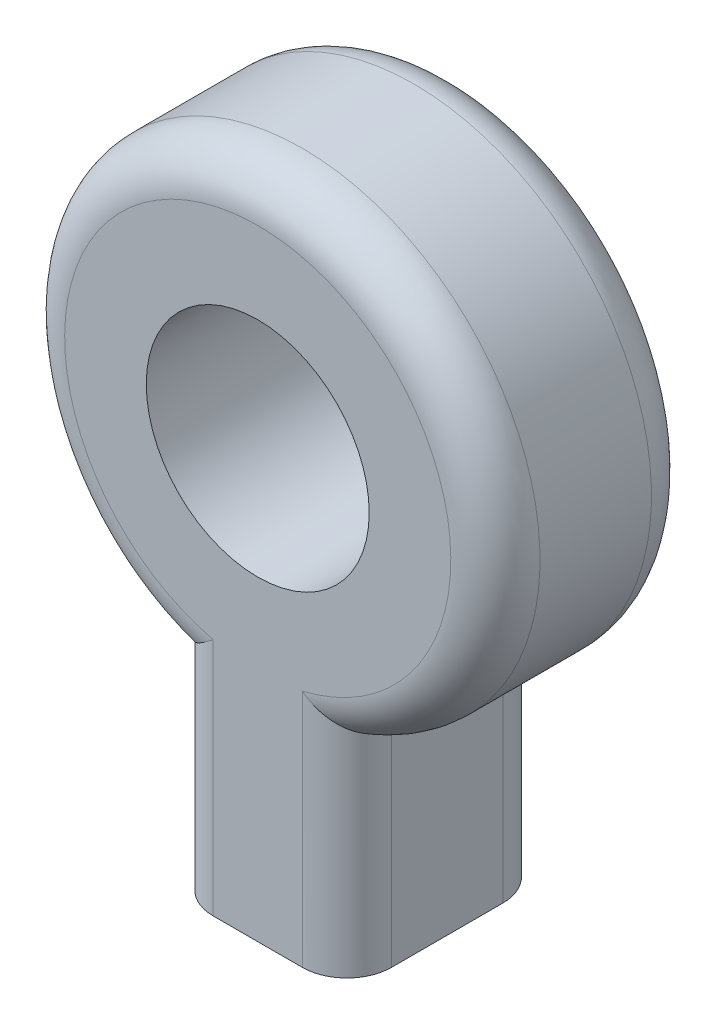
ISO-10303-21;
HEADER;
FILE_DESCRIPTION(('STEP AP214'),'2;1');
FILE_NAME('part.step','',(''),(''),'','','');
FILE_SCHEMA(('AUTOMOTIVE_DESIGN { 1 0 10303 214 1 1 1 1 }'));
ENDSEC;
DATA;
#1=APPLICATION_CONTEXT('core data for automotive mechanical design processes');
#2=APPLICATION_PROTOCOL_DEFINITION('international standard','automotive_design',2000,#1);
#3=PRODUCT_CONTEXT('',#1,'mechanical');
#4=PRODUCT('Part','Part','',(#3));
#5=PRODUCT_RELATED_PRODUCT_CATEGORY('part','',(#4));
#6=PRODUCT_DEFINITION_FORMATION('','',#4);
#7=PRODUCT_DEFINITION_CONTEXT('part definition',#1,'design');
#8=PRODUCT_DEFINITION('design','',#6,#7);
#9=PRODUCT_DEFINITION_SHAPE('','',#8);
#10=(LENGTH_UNIT() NAMED_UNIT(*) SI_UNIT(.MILLI.,.METRE.));
#11=(NAMED_UNIT(*) PLANE_ANGLE_UNIT() SI_UNIT($,.RADIAN.));
#12=(NAMED_UNIT(*) SI_UNIT($,.STERADIAN.) SOLID_ANGLE_UNIT());
#13=UNCERTAINTY_MEASURE_WITH_UNIT(LENGTH_MEASURE(1.E-05),#10,'distance_accuracy_value','');
#14=(GEOMETRIC_REPRESENTATION_CONTEXT(3) GLOBAL_UNCERTAINTY_ASSIGNED_CONTEXT((#13)) GLOBAL_UNIT_ASSIGNED_CONTEXT((#10,
#11,#12)) REPRESENTATION_CONTEXT('',''));
#15=CARTESIAN_POINT('',(0.,0.,0.));
#16=DIRECTION('',(0.,0.,1.));
#17=DIRECTION('',(1.,0.,0.));
#18=AXIS2_PLACEMENT_3D('',#15,#16,#17);
#19=CARTESIAN_POINT('',(0.,28.7650596911522,9.));
#20=DIRECTION('',(0.,0.,1.));
#21=DIRECTION('',(1.,0.,0.));
#22=AXIS2_PLACEMENT_3D('',#19,#20,#21);
#23=PLANE('',#22);
#24=CARTESIAN_POINT('',(0.,28.7650596911522,9.));
#25=DIRECTION('',(0.,0.,1.));
#26=DIRECTION('',(1.,0.,0.));
#27=AXIS2_PLACEMENT_3D('',#24,#25,#26);
#28=CIRCLE('',#27,8.66021948891792);
#29=CARTESIAN_POINT('',(2.00000000000001,20.3389454267813,9.));
#30=VERTEX_POINT('',#29);
#31=CARTESIAN_POINT('',(-1.9962519981702,20.3380566915066,9.));
#32=VERTEX_POINT('',#31);
#33=EDGE_CURVE('E54',#30,#32,#28,.T.);
#34=ORIENTED_EDGE('',*,*,#33,.T.);
#35=DIRECTION('',(0.,-1.,0.));
#36=VECTOR('',#35,1.);
#37=CARTESIAN_POINT('',(-1.9962519981702,9.60335118495618,9.));
#38=LINE('',#37,#36);
#39=CARTESIAN_POINT('',(-1.9962519981702,9.60335118495618,9.));
#40=VERTEX_POINT('',#39);
#41=EDGE_CURVE('E11',#32,#40,#38,.T.);
#42=ORIENTED_EDGE('',*,*,#41,.T.);
#43=DIRECTION('',(1.,0.,0.));
#44=VECTOR('',#43,1.);
#45=CARTESIAN_POINT('',(0.,9.60335118495618,9.));
#46=LINE('',#45,#44);
#47=CARTESIAN_POINT('',(2.00000000000001,9.60335118495618,9.));
#48=VERTEX_POINT('',#47);
#49=EDGE_CURVE('E227',#40,#48,#46,.T.);
#50=ORIENTED_EDGE('',*,*,#49,.T.);
#51=DIRECTION('',(0.,1.,0.));
#52=VECTOR('',#51,1.);
#53=CARTESIAN_POINT('',(2.00000000000001,18.8837500840249,9.));
#54=LINE('',#53,#52);
#55=EDGE_CURVE('E47',#48,#30,#54,.T.);
#56=ORIENTED_EDGE('',*,*,#55,.T.);
#57=EDGE_LOOP('',(#34,#42,#50,#56));
#58=FACE_BOUND('',#57,.T.);
#59=CARTESIAN_POINT('',(0.,28.7650596911522,9.));
#60=DIRECTION('',(0.,0.,1.));
#61=DIRECTION('',(1.,0.,0.));
#62=AXIS2_PLACEMENT_3D('',#59,#60,#61);
#63=CIRCLE('',#62,5.);
#64=CARTESIAN_POINT('',(5.,28.7650596911522,9.));
#65=VERTEX_POINT('',#64);
#66=EDGE_CURVE('E231',#65,#65,#63,.T.);
#67=ORIENTED_EDGE('',*,*,#66,.F.);
#68=EDGE_LOOP('',(#67));
#69=FACE_BOUND('',#68,.T.);
#70=ADVANCED_FACE('F33',(#58,#69),#23,.T.);
#71=CARTESIAN_POINT('',(0.,28.7650596911522,0.));
#72=DIRECTION('',(0.,0.,1.));
#73=DIRECTION('',(1.,0.,0.));
#74=AXIS2_PLACEMENT_3D('',#71,#72,#73);
#75=PLANE('',#74);
#76=CARTESIAN_POINT('',(0.,28.7650596911522,0.));
#77=DIRECTION('',(0.,0.,1.));
#78=DIRECTION('',(1.,0.,0.));
#79=AXIS2_PLACEMENT_3D('',#76,#77,#78);
#80=CIRCLE('',#79,8.66021948891792);
#81=CARTESIAN_POINT('',(-1.9962519981702,20.3380566915066,0.));
#82=VERTEX_POINT('',#81);
#83=CARTESIAN_POINT('',(2.00000000000001,20.3389454267813,0.));
#84=VERTEX_POINT('',#83);
#85=EDGE_CURVE('E217',#82,#84,#80,.F.);
#86=ORIENTED_EDGE('',*,*,#85,.T.);
#87=DIRECTION('',(0.,1.,0.));
#88=VECTOR('',#87,1.);
#89=CARTESIAN_POINT('',(2.00000000000001,28.7650596911522,0.));
#90=LINE('',#89,#88);
#91=CARTESIAN_POINT('',(2.00000000000001,9.60335118495618,0.));
#92=VERTEX_POINT('',#91);
#93=EDGE_CURVE('E215',#84,#92,#90,.F.);
#94=ORIENTED_EDGE('',*,*,#93,.T.);
#95=DIRECTION('',(1.,0.,0.));
#96=VECTOR('',#95,1.);
#97=CARTESIAN_POINT('',(-3.9962519981702,9.60335118495618,0.));
#98=LINE('',#97,#96);
#99=CARTESIAN_POINT('',(-1.9962519981702,9.60335118495618,0.));
#100=VERTEX_POINT('',#99);
#101=EDGE_CURVE('E228',#100,#92,#98,.T.);
#102=ORIENTED_EDGE('',*,*,#101,.F.);
#103=DIRECTION('',(0.,-1.,0.));
#104=VECTOR('',#103,1.);
#105=CARTESIAN_POINT('',(-1.9962519981702,28.7650596911522,0.));
#106=LINE('',#105,#104);
#107=EDGE_CURVE('E219',#100,#82,#106,.F.);
#108=ORIENTED_EDGE('',*,*,#107,.T.);
#109=EDGE_LOOP('',(#86,#94,#102,#108));
#110=FACE_BOUND('',#109,.T.);
#111=CARTESIAN_POINT('',(0.,28.7650596911522,0.));
#112=DIRECTION('',(0.,0.,1.));
#113=DIRECTION('',(1.,0.,0.));
#114=AXIS2_PLACEMENT_3D('',#111,#112,#113);
#115=CIRCLE('',#114,5.);
#116=CARTESIAN_POINT('',(5.,28.7650596911522,0.));
#117=VERTEX_POINT('',#116);
#118=EDGE_CURVE('E233',#117,#117,#115,.T.);
#119=ORIENTED_EDGE('',*,*,#118,.T.);
#120=EDGE_LOOP('',(#119));
#121=FACE_BOUND('',#120,.T.);
#122=ADVANCED_FACE('F168',(#110,#121),#75,.F.);
#123=CARTESIAN_POINT('',(4.00000000000001,9.60335118495618,9.));
#124=DIRECTION('',(-1.,0.,0.));
#125=DIRECTION('',(0.,0.,1.));
#126=AXIS2_PLACEMENT_3D('',#123,#124,#125);
#127=PLANE('',#126);
#128=DIRECTION('',(0.,0.,-1.));
#129=VECTOR('',#128,1.);
#130=CARTESIAN_POINT('',(4.00000000000001,9.60335118495618,9.));
#131=LINE('',#130,#129);
#132=CARTESIAN_POINT('',(4.00000000000001,9.60335118495618,7.));
#133=VERTEX_POINT('',#132);
#134=CARTESIAN_POINT('',(4.00000000000001,9.60335118495618,2.));
#135=VERTEX_POINT('',#134);
#136=EDGE_CURVE('E126',#133,#135,#131,.T.);
#137=ORIENTED_EDGE('',*,*,#136,.T.);
#138=DIRECTION('',(0.,1.,0.));
#139=VECTOR('',#138,1.);
#140=CARTESIAN_POINT('',(4.00000000000001,9.60335118495618,2.));
#141=LINE('',#140,#139);
#142=CARTESIAN_POINT('',(4.,18.8837500840249,2.));
#143=VERTEX_POINT('',#142);
#144=EDGE_CURVE('E125',#135,#143,#141,.T.);
#145=ORIENTED_EDGE('',*,*,#144,.T.);
#146=DIRECTION('',(0.,0.,-1.));
#147=VECTOR('',#146,1.);
#148=CARTESIAN_POINT('',(4.,18.8837500840249,9.));
#149=LINE('',#148,#147);
#150=CARTESIAN_POINT('',(4.,18.8837500840249,7.));
#151=VERTEX_POINT('',#150);
#152=EDGE_CURVE('E108',#151,#143,#149,.T.);
#153=ORIENTED_EDGE('',*,*,#152,.F.);
#154=DIRECTION('',(0.,1.,0.));
#155=VECTOR('',#154,1.);
#156=CARTESIAN_POINT('',(4.00000000000001,9.60335118495618,7.));
#157=LINE('',#156,#155);
#158=EDGE_CURVE('E122',#151,#133,#157,.F.);
#159=ORIENTED_EDGE('',*,*,#158,.T.);
#160=EDGE_LOOP('',(#137,#145,#153,#159));
#161=FACE_BOUND('',#160,.T.);
#162=ADVANCED_FACE('F121',(#161),#127,.F.);
#163=CARTESIAN_POINT('',(0.,28.7650596911522,9.));
#164=DIRECTION('',(0.,0.,-1.));
#165=DIRECTION('',(-1.,0.,0.));
#166=AXIS2_PLACEMENT_3D('',#163,#164,#165);
#167=CYLINDRICAL_SURFACE('',#166,10.6602194889179);
#168=ORIENTED_EDGE('',*,*,#152,.T.);
#169=CARTESIAN_POINT('',(0.,28.7650596911522,2.));
#170=DIRECTION('',(0.,0.,1.));
#171=DIRECTION('',(1.,0.,0.));
#172=AXIS2_PLACEMENT_3D('',#169,#170,#171);
#173=CIRCLE('',#172,10.6602194889179);
#174=CARTESIAN_POINT('',(-3.9962519981702,18.8822337026494,2.));
#175=VERTEX_POINT('',#174);
#176=EDGE_CURVE('E114',#143,#175,#173,.T.);
#177=ORIENTED_EDGE('',*,*,#176,.T.);
#178=DIRECTION('',(0.,0.,-1.));
#179=VECTOR('',#178,1.);
#180=CARTESIAN_POINT('',(-3.9962519981702,18.8822337026494,9.));
#181=LINE('',#180,#179);
#182=CARTESIAN_POINT('',(-3.9962519981702,18.8822337026494,7.));
#183=VERTEX_POINT('',#182);
#184=EDGE_CURVE('E110',#183,#175,#181,.T.);
#185=ORIENTED_EDGE('',*,*,#184,.F.);
#186=CARTESIAN_POINT('',(0.,28.7650596911522,7.));
#187=DIRECTION('',(0.,0.,1.));
#188=DIRECTION('',(1.,0.,0.));
#189=AXIS2_PLACEMENT_3D('',#186,#187,#188);
#190=CIRCLE('',#189,10.6602194889179);
#191=EDGE_CURVE('E105',#183,#151,#190,.F.);
#192=ORIENTED_EDGE('',*,*,#191,.T.);
#193=EDGE_LOOP('',(#168,#177,#185,#192));
#194=FACE_BOUND('',#193,.T.);
#195=ADVANCED_FACE('F107',(#194),#167,.T.);
#196=CARTESIAN_POINT('',(-3.9962519981702,18.8822337026494,9.));
#197=DIRECTION('',(1.,0.,0.));
#198=DIRECTION('',(0.,1.,0.));
#199=AXIS2_PLACEMENT_3D('',#196,#197,#198);
#200=PLANE('',#199);
#201=ORIENTED_EDGE('',*,*,#184,.T.);
#202=DIRECTION('',(0.,-1.,0.));
#203=VECTOR('',#202,1.);
#204=CARTESIAN_POINT('',(-3.9962519981702,18.8822337026494,2.));
#205=LINE('',#204,#203);
#206=CARTESIAN_POINT('',(-3.9962519981702,9.60335118495618,2.));
#207=VERTEX_POINT('',#206);
#208=EDGE_CURVE('E204',#175,#207,#205,.T.);
#209=ORIENTED_EDGE('',*,*,#208,.T.);
#210=DIRECTION('',(0.,0.,-1.));
#211=VECTOR('',#210,1.);
#212=CARTESIAN_POINT('',(-3.9962519981702,9.60335118495618,9.));
#213=LINE('',#212,#211);
#214=CARTESIAN_POINT('',(-3.9962519981702,9.60335118495618,7.));
#215=VERTEX_POINT('',#214);
#216=EDGE_CURVE('E224',#215,#207,#213,.T.);
#217=ORIENTED_EDGE('',*,*,#216,.F.);
#218=DIRECTION('',(0.,-1.,0.));
#219=VECTOR('',#218,1.);
#220=CARTESIAN_POINT('',(-3.9962519981702,18.8822337026494,7.));
#221=LINE('',#220,#219);
#222=EDGE_CURVE('E206',#215,#183,#221,.F.);
#223=ORIENTED_EDGE('',*,*,#222,.T.);
#224=EDGE_LOOP('',(#201,#209,#217,#223));
#225=FACE_BOUND('',#224,.T.);
#226=ADVANCED_FACE('F183',(#225),#200,.F.);
#227=CARTESIAN_POINT('',(-3.9962519981702,9.60335118495618,9.));
#228=DIRECTION('',(0.,1.,0.));
#229=DIRECTION('',(0.,0.,1.));
#230=AXIS2_PLACEMENT_3D('',#227,#228,#229);
#231=PLANE('',#230);
#232=CARTESIAN_POINT('',(0.,9.60335118495618,4.56914072073836));
#233=DIRECTION('',(0.,-1.,0.));
#234=DIRECTION('',(0.,0.,-1.));
#235=AXIS2_PLACEMENT_3D('',#232,#233,#234);
#236=CIRCLE('',#235,3.);
#237=CARTESIAN_POINT('',(0.,9.60335118495618,1.56914072073836));
#238=VERTEX_POINT('',#237);
#239=EDGE_CURVE('E142',#238,#238,#236,.T.);
#240=ORIENTED_EDGE('',*,*,#239,.F.);
#241=EDGE_LOOP('',(#240));
#242=FACE_BOUND('',#241,.T.);
#243=ORIENTED_EDGE('',*,*,#101,.T.);
#244=CARTESIAN_POINT('',(2.00000000000001,9.60335118495618,2.));
#245=DIRECTION('',(0.,1.,0.));
#246=DIRECTION('',(0.,0.,1.));
#247=AXIS2_PLACEMENT_3D('',#244,#245,#246);
#248=CIRCLE('',#247,2.);
#249=EDGE_CURVE('E115',#92,#135,#248,.F.);
#250=ORIENTED_EDGE('',*,*,#249,.T.);
#251=ORIENTED_EDGE('',*,*,#136,.F.);
#252=CARTESIAN_POINT('',(2.00000000000001,9.60335118495618,7.));
#253=DIRECTION('',(0.,1.,0.));
#254=DIRECTION('',(0.,0.,1.));
#255=AXIS2_PLACEMENT_3D('',#252,#253,#254);
#256=CIRCLE('',#255,2.);
#257=EDGE_CURVE('E130',#133,#48,#256,.F.);
#258=ORIENTED_EDGE('',*,*,#257,.T.);
#259=ORIENTED_EDGE('',*,*,#49,.F.);
#260=CARTESIAN_POINT('',(-1.9962519981702,9.60335118495618,7.));
#261=DIRECTION('',(0.,1.,0.));
#262=DIRECTION('',(0.,0.,1.));
#263=AXIS2_PLACEMENT_3D('',#260,#261,#262);
#264=CIRCLE('',#263,2.);
#265=EDGE_CURVE('E212',#40,#215,#264,.F.);
#266=ORIENTED_EDGE('',*,*,#265,.T.);
#267=ORIENTED_EDGE('',*,*,#216,.T.);
#268=CARTESIAN_POINT('',(-1.9962519981702,9.60335118495618,2.));
#269=DIRECTION('',(0.,1.,0.));
#270=DIRECTION('',(0.,0.,1.));
#271=AXIS2_PLACEMENT_3D('',#268,#269,#270);
#272=CIRCLE('',#271,2.);
#273=EDGE_CURVE('E210',#207,#100,#272,.F.);
#274=ORIENTED_EDGE('',*,*,#273,.T.);
#275=EDGE_LOOP('',(#243,#250,#251,#258,#259,#266,#267,#274));
#276=FACE_BOUND('',#275,.T.);
#277=ADVANCED_FACE('F180',(#242,#276),#231,.F.);
#278=CARTESIAN_POINT('',(0.,28.7650596911522,9.));
#279=DIRECTION('',(0.,0.,-1.));
#280=DIRECTION('',(-1.,0.,0.));
#281=AXIS2_PLACEMENT_3D('',#278,#279,#280);
#282=CYLINDRICAL_SURFACE('',#281,5.);
#283=ORIENTED_EDGE('',*,*,#66,.T.);
#284=EDGE_LOOP('',(#283));
#285=FACE_BOUND('',#284,.T.);
#286=ORIENTED_EDGE('',*,*,#118,.F.);
#287=EDGE_LOOP('',(#286));
#288=FACE_BOUND('',#287,.T.);
#289=ADVANCED_FACE('F177',(#285,#288),#282,.F.);
#290=CARTESIAN_POINT('',(-1.9962519981702,18.8822337026494,2.));
#291=DIRECTION('',(0.,-1.,0.));
#292=DIRECTION('',(1.,0.,0.));
#293=AXIS2_PLACEMENT_3D('',#290,#291,#292);
#294=CYLINDRICAL_SURFACE('',#293,2.);
#295=ORIENTED_EDGE('',*,*,#273,.F.);
#296=ORIENTED_EDGE('',*,*,#208,.F.);
#297=CARTESIAN_POINT('',(-3.9962519981702,18.8822337026494,2.));
#298=CARTESIAN_POINT('',(-3.99626122357544,18.8822284248516,1.95078015179967));
#299=CARTESIAN_POINT('',(-3.99443530883954,18.8834587149459,1.90156561154152));
#300=CARTESIAN_POINT('',(-3.98718371502805,18.8883497661438,1.80354236597555));
#301=CARTESIAN_POINT('',(-3.98175941496516,18.8920095961727,1.75473351244857));
#302=CARTESIAN_POINT('',(-3.96741628824523,18.9016956046794,1.65811314703024));
#303=CARTESIAN_POINT('',(-3.95851451524217,18.9077102354417,1.61029794944754));
#304=CARTESIAN_POINT('',(-3.93735404063978,18.9220259946845,1.51577693035738));
#305=CARTESIAN_POINT('',(-3.9250951619568,18.9303272437817,1.46907116751267));
#306=CARTESIAN_POINT('',(-3.88354985592826,18.9585047891648,1.33120550815071));
#307=CARTESIAN_POINT('',(-3.84946457408325,18.9816751422819,1.24209939916828));
#308=CARTESIAN_POINT('',(-3.77018894432698,19.0358241132337,1.07154761268315));
#309=CARTESIAN_POINT('',(-3.72498775252442,19.0668103564578,0.990109523482096));
#310=CARTESIAN_POINT('',(-3.62250112656296,19.1374827165494,0.831794124688671));
#311=CARTESIAN_POINT('',(-3.56466938079167,19.1775673097876,0.755450166328622));
#312=CARTESIAN_POINT('',(-3.4409144528931,19.2639747927498,0.613703980858329));
#313=CARTESIAN_POINT('',(-3.37498905632077,19.3102993900945,0.548304759876112));
#314=CARTESIAN_POINT('',(-3.22602392643064,19.41584027258,0.419222374366774));
#315=CARTESIAN_POINT('',(-3.14193141836919,19.4759343672328,0.357475558992229));
#316=CARTESIAN_POINT('',(-2.96816364350988,19.6014413080748,0.249029471080511));
#317=CARTESIAN_POINT('',(-2.87848285549452,19.6668594345734,0.202345371024312));
#318=CARTESIAN_POINT('',(-2.67860165027871,19.8143560961146,0.116291154826333));
#319=CARTESIAN_POINT('',(-2.56771076695944,19.8972561245496,0.0799414440868841));
#320=CARTESIAN_POINT('',(-2.34429800812875,20.066767560369,0.0271790327390546));
#321=CARTESIAN_POINT('',(-2.2317782638339,20.1533743651672,0.0107423100582177));
#322=CARTESIAN_POINT('',(-2.08083409041852,20.2713790188956,0.00141074699120206));
#323=CARTESIAN_POINT('',(-2.04206071939154,20.301853997934,0.000150243912356059));
#324=CARTESIAN_POINT('',(-2.00099373746383,20.3343076105949,4.21694619416417E-06));
#325=CARTESIAN_POINT('',(-1.99862271844948,20.3361819569129,1.91203697017922E-09));
#326=CARTESIAN_POINT('',(-1.9962519981702,20.3380566915066,0.));
#327=B_SPLINE_CURVE_WITH_KNOTS('',3,(#297,#298,#299,#300,#301,#302,#303,#304,#305,#306,#307,
#308,#309,#310,#311,#312,#313,#314,#315,#316,#317,#318,#319,#320,#321,#322,#323,#324,#325,#326),
.UNSPECIFIED.,.F.,.F.,(4,2,2,2,2,2,2,2,2,2,2,2,2,2,4),(0.,0.147601487794811,0.2951464427801,
0.441976736193232,0.588814776235774,0.881895163894845,1.17526260205321,1.48553764586616,
1.79589777176707,2.15574474237638,2.51595305878731,2.94381350049727,3.37115727630907,
3.51911825661596,3.52818545874163),.UNSPECIFIED.);
#328=EDGE_CURVE('E135',#82,#175,#327,.F.);
#329=ORIENTED_EDGE('',*,*,#328,.F.);
#330=ORIENTED_EDGE('',*,*,#107,.F.);
#331=EDGE_LOOP('',(#295,#296,#329,#330));
#332=FACE_BOUND('',#331,.T.);
#333=ADVANCED_FACE('F256',(#332),#294,.T.);
#334=CARTESIAN_POINT('',(0.,28.7650596911522,2.));
#335=DIRECTION('',(0.,0.,1.));
#336=DIRECTION('',(1.,0.,0.));
#337=AXIS2_PLACEMENT_3D('',#334,#335,#336);
#338=TOROIDAL_SURFACE('',#337,8.66021948891792,2.);
#339=ORIENTED_EDGE('',*,*,#328,.T.);
#340=ORIENTED_EDGE('',*,*,#176,.F.);
#341=CARTESIAN_POINT('',(4.,18.8837500840249,2.));
#342=CARTESIAN_POINT('',(4.00000922368036,18.8837448096422,1.95077590802549));
#343=CARTESIAN_POINT('',(3.99818299722824,18.8849748064946,1.90155712215185));
#344=CARTESIAN_POINT('',(3.99093014684629,18.8898647040558,1.80352537831182));
#345=CARTESIAN_POINT('',(3.98550490133219,18.8935236744739,1.75471227221542));
#346=CARTESIAN_POINT('',(3.97115922615978,18.9032074399699,1.65808331412721));
#347=CARTESIAN_POINT('',(3.96225584473796,18.9092206957271,1.61026377824288));
#348=CARTESIAN_POINT('',(3.94109147937062,18.923533226539,1.51573412349467));
#349=CARTESIAN_POINT('',(3.9288303184619,18.9318326220789,1.46902406324392));
#350=CARTESIAN_POINT('',(3.88727709837328,18.9600039944267,1.33114553105213));
#351=CARTESIAN_POINT('',(3.85318512834112,18.9831694000172,1.24203095323037));
#352=CARTESIAN_POINT('',(3.77389325266284,19.0373072674519,1.07146305090219));
#353=CARTESIAN_POINT('',(3.72868250803365,19.068287348085,0.99001731003716));
#354=CARTESIAN_POINT('',(3.62617467399787,19.1389453276208,0.831689653948475));
#355=CARTESIAN_POINT('',(3.56833136769175,19.1790214675837,0.755340917347559));
#356=CARTESIAN_POINT('',(3.44455085446957,19.2654112891507,0.613586920423197));
#357=CARTESIAN_POINT('',(3.37861143264503,19.3117266780063,0.548184666418519));
#358=CARTESIAN_POINT('',(3.22962046313914,19.4172424033488,0.419104171694145));
#359=CARTESIAN_POINT('',(3.14551646917437,19.4773198918424,0.357361428010906));
#360=CARTESIAN_POINT('',(2.97172435857855,19.6027924201645,0.248925073611785));
#361=CARTESIAN_POINT('',(2.88203071891181,19.6681927395556,0.202246638258926));
#362=CARTESIAN_POINT('',(2.68213125540909,19.815641380215,0.11621208881559));
#363=CARTESIAN_POINT('',(2.57123525140741,19.8985104333531,0.0798747916256295));
#364=CARTESIAN_POINT('',(2.34781202194297,20.0679580573316,0.0271376500155976));
#365=CARTESIAN_POINT('',(2.23528693103274,20.1545320215962,0.0107137510764177));
#366=CARTESIAN_POINT('',(2.08441994091223,20.2724255451675,0.00140549836428077));
#367=CARTESIAN_POINT('',(2.04572866850118,20.3028225086915,0.000149990594465479));
#368=CARTESIAN_POINT('',(2.00474282305427,20.3351972026871,4.21887703164546E-06));
#369=CARTESIAN_POINT('',(2.00237126227224,20.3370711205654,1.91588530590229E-09));
#370=CARTESIAN_POINT('',(2.00000000000001,20.3389454267813,0.));
#371=B_SPLINE_CURVE_WITH_KNOTS('',3,(#341,#342,#343,#344,#345,#346,#347,#348,#349,#350,#351,
#352,#353,#354,#355,#356,#357,#358,#359,#360,#361,#362,#363,#364,#365,#366,#367,#368,#369,#370),
.UNSPECIFIED.,.F.,.F.,(4,2,2,2,2,2,2,2,2,2,2,2,2,2,4),(0.,0.147614221976313,0.295171940672569,
0.442015294691447,0.58886638920506,0.881973149135116,1.17536678065796,1.4856616701914,
1.79604163911619,2.15588139674413,2.51608252350959,2.94389159978855,3.3711833848001,
3.5188061250612,3.527873805358),.UNSPECIFIED.);
#372=EDGE_CURVE('E133',#84,#143,#371,.F.);
#373=ORIENTED_EDGE('',*,*,#372,.F.);
#374=ORIENTED_EDGE('',*,*,#85,.F.);
#375=EDGE_LOOP('',(#339,#340,#373,#374));
#376=FACE_BOUND('',#375,.T.);
#377=ADVANCED_FACE('F194',(#376),#338,.T.);
#378=CARTESIAN_POINT('',(2.00000000000001,9.60335118495618,2.));
#379=DIRECTION('',(0.,1.,0.));
#380=DIRECTION('',(0.,0.,1.));
#381=AXIS2_PLACEMENT_3D('',#378,#379,#380);
#382=CYLINDRICAL_SURFACE('',#381,2.);
#383=ORIENTED_EDGE('',*,*,#249,.F.);
#384=ORIENTED_EDGE('',*,*,#93,.F.);
#385=ORIENTED_EDGE('',*,*,#372,.T.);
#386=ORIENTED_EDGE('',*,*,#144,.F.);
#387=EDGE_LOOP('',(#383,#384,#385,#386));
#388=FACE_BOUND('',#387,.T.);
#389=ADVANCED_FACE('F166',(#388),#382,.T.);
#390=CARTESIAN_POINT('',(2.00000000000001,28.7650596911522,7.));
#391=DIRECTION('',(0.,-1.,0.));
#392=DIRECTION('',(0.,0.,-1.));
#393=AXIS2_PLACEMENT_3D('',#390,#391,#392);
#394=CYLINDRICAL_SURFACE('',#393,2.);
#395=ORIENTED_EDGE('',*,*,#257,.F.);
#396=ORIENTED_EDGE('',*,*,#158,.F.);
#397=CARTESIAN_POINT('',(4.,18.8837500840249,7.));
#398=CARTESIAN_POINT('',(4.00000922368036,18.8837448096422,7.04922409197451));
#399=CARTESIAN_POINT('',(3.99818299722824,18.8849748064946,7.09844287784815));
#400=CARTESIAN_POINT('',(3.99093014684629,18.8898647040558,7.19647462168818));
#401=CARTESIAN_POINT('',(3.98550490133219,18.8935236744739,7.24528772778458));
#402=CARTESIAN_POINT('',(3.97115922615978,18.9032074399699,7.34191668587279));
#403=CARTESIAN_POINT('',(3.96225584473796,18.9092206957271,7.38973622175712));
#404=CARTESIAN_POINT('',(3.94109147937062,18.923533226539,7.48426587650533));
#405=CARTESIAN_POINT('',(3.9288303184619,18.9318326220789,7.53097593675608));
#406=CARTESIAN_POINT('',(3.88727709837329,18.9600039944267,7.66885446894787));
#407=CARTESIAN_POINT('',(3.85318512834112,18.9831694000172,7.75796904676963));
#408=CARTESIAN_POINT('',(3.77389325266284,19.0373072674519,7.92853694909781));
#409=CARTESIAN_POINT('',(3.72868250803365,19.068287348085,8.00998268996284));
#410=CARTESIAN_POINT('',(3.62617467399787,19.1389453276208,8.16831034605152));
#411=CARTESIAN_POINT('',(3.56833136769175,19.1790214675836,8.24465908265244));
#412=CARTESIAN_POINT('',(3.44455085446957,19.2654112891507,8.3864130795768));
#413=CARTESIAN_POINT('',(3.37861143264504,19.3117266780063,8.45181533358148));
#414=CARTESIAN_POINT('',(3.22962046313914,19.4172424033488,8.58089582830585));
#415=CARTESIAN_POINT('',(3.14551646917436,19.4773198918424,8.64263857198909));
#416=CARTESIAN_POINT('',(2.97172435857855,19.6027924201645,8.75107492638822));
#417=CARTESIAN_POINT('',(2.88203071891183,19.6681927395556,8.79775336174107));
#418=CARTESIAN_POINT('',(2.68213125540907,19.8156413802149,8.88378791118441));
#419=CARTESIAN_POINT('',(2.57123525140731,19.898510433353,8.92012520837437));
#420=CARTESIAN_POINT('',(2.34781202194308,20.0679580573317,8.9728623499844));
#421=CARTESIAN_POINT('',(2.23528693103314,20.1545320215967,8.98928624892358));
#422=CARTESIAN_POINT('',(2.08441994091209,20.2724255451673,8.99859450163572));
#423=CARTESIAN_POINT('',(2.04572866850083,20.302822508691,8.99985000940553));
#424=CARTESIAN_POINT('',(2.00474282305423,20.3351972026871,8.99999578112297));
#425=CARTESIAN_POINT('',(2.00237126227222,20.3370711205654,8.99999999808411));
#426=CARTESIAN_POINT('',(2.00000000000001,20.3389454267813,9.));
#427=B_SPLINE_CURVE_WITH_KNOTS('',3,(#397,#398,#399,#400,#401,#402,#403,#404,#405,#406,#407,
#408,#409,#410,#411,#412,#413,#414,#415,#416,#417,#418,#419,#420,#421,#422,#423,#424,#425,#426),
.UNSPECIFIED.,.F.,.F.,(4,2,2,2,2,2,2,2,2,2,2,2,2,2,4),(0.,0.147614221976313,0.295171940672569,
0.442015294691447,0.58886638920506,0.881973149135114,1.17536678065796,1.4856616701914,
1.79604163911619,2.15588139674414,2.51608252350959,2.94389159978854,3.37118338480009,
3.5188061250612,3.527873805358),.UNSPECIFIED.);
#428=EDGE_CURVE('E38',#30,#151,#427,.F.);
#429=ORIENTED_EDGE('',*,*,#428,.F.);
#430=ORIENTED_EDGE('',*,*,#55,.F.);
#431=EDGE_LOOP('',(#395,#396,#429,#430));
#432=FACE_BOUND('',#431,.T.);
#433=ADVANCED_FACE('F35',(#432),#394,.T.);
#434=CARTESIAN_POINT('',(0.,28.7650596911522,7.));
#435=DIRECTION('',(0.,0.,1.));
#436=DIRECTION('',(1.,0.,0.));
#437=AXIS2_PLACEMENT_3D('',#434,#435,#436);
#438=TOROIDAL_SURFACE('',#437,8.66021948891792,2.);
#439=ORIENTED_EDGE('',*,*,#428,.T.);
#440=ORIENTED_EDGE('',*,*,#191,.F.);
#441=CARTESIAN_POINT('',(-3.9962519981702,18.8822337026494,7.));
#442=CARTESIAN_POINT('',(-3.99626122357544,18.8822284248516,7.04921984820033));
#443=CARTESIAN_POINT('',(-3.99443530883954,18.8834587149459,7.09843438845848));
#444=CARTESIAN_POINT('',(-3.98718371502805,18.8883497661438,7.19645763402445));
#445=CARTESIAN_POINT('',(-3.98175941496516,18.8920095961727,7.24526648755142));
#446=CARTESIAN_POINT('',(-3.96741628824523,18.9016956046794,7.34188685296975));
#447=CARTESIAN_POINT('',(-3.95851451524217,18.9077102354417,7.38970205055246));
#448=CARTESIAN_POINT('',(-3.93735404063978,18.9220259946845,7.48422306964262));
#449=CARTESIAN_POINT('',(-3.9250951619568,18.9303272437817,7.53092883248732));
#450=CARTESIAN_POINT('',(-3.88354985592826,18.9585047891648,7.66879449184928));
#451=CARTESIAN_POINT('',(-3.84946457408325,18.9816751422819,7.75790060083172));
#452=CARTESIAN_POINT('',(-3.77018894432698,19.0358241132337,7.92845238731685));
#453=CARTESIAN_POINT('',(-3.72498775252442,19.0668103564578,8.0098904765179));
#454=CARTESIAN_POINT('',(-3.62250112656297,19.1374827165494,8.16820587531132));
#455=CARTESIAN_POINT('',(-3.56466938079167,19.1775673097876,8.24454983367137));
#456=CARTESIAN_POINT('',(-3.44091445289311,19.2639747927498,8.38629601914167));
#457=CARTESIAN_POINT('',(-3.37498905632077,19.3102993900945,8.45169524012388));
#458=CARTESIAN_POINT('',(-3.22602392643064,19.41584027258,8.58077762563322));
#459=CARTESIAN_POINT('',(-3.14193141836918,19.4759343672327,8.64252444100777));
#460=CARTESIAN_POINT('',(-2.96816364350988,19.6014413080748,8.75097052891949));
#461=CARTESIAN_POINT('',(-2.87848285549455,19.6668594345734,8.79765462897569));
#462=CARTESIAN_POINT('',(-2.67860165027869,19.8143560961146,8.88370884517366));
#463=CARTESIAN_POINT('',(-2.56771076695934,19.8972561245495,8.92005855591311));
#464=CARTESIAN_POINT('',(-2.34429800812887,20.0667675603692,8.97282096726094));
#465=CARTESIAN_POINT('',(-2.23177826383432,20.1533743651677,8.98925768994178));
#466=CARTESIAN_POINT('',(-2.08083409041838,20.2713790188954,8.9985892530088));
#467=CARTESIAN_POINT('',(-2.04206071939117,20.3018539979336,8.99984975608765));
#468=CARTESIAN_POINT('',(-2.00099373746379,20.3343076105949,8.99999578305381));
#469=CARTESIAN_POINT('',(-1.99862271844946,20.3361819569128,8.99999999808796));
#470=CARTESIAN_POINT('',(-1.9962519981702,20.3380566915066,9.));
#471=B_SPLINE_CURVE_WITH_KNOTS('',3,(#441,#442,#443,#444,#445,#446,#447,#448,#449,#450,#451,
#452,#453,#454,#455,#456,#457,#458,#459,#460,#461,#462,#463,#464,#465,#466,#467,#468,#469,#470),
.UNSPECIFIED.,.F.,.F.,(4,2,2,2,2,2,2,2,2,2,2,2,2,2,4),(0.,0.147601487794812,0.295146442780099,
0.441976736193231,0.588814776235773,0.881895163894843,1.17526260205321,1.48553764586616,
1.79589777176706,2.15574474237639,2.51595305878731,2.94381350049725,3.37115727630907,
3.51911825661596,3.52818545874162),.UNSPECIFIED.);
#472=EDGE_CURVE('E134',#32,#183,#471,.F.);
#473=ORIENTED_EDGE('',*,*,#472,.F.);
#474=ORIENTED_EDGE('',*,*,#33,.F.);
#475=EDGE_LOOP('',(#439,#440,#473,#474));
#476=FACE_BOUND('',#475,.T.);
#477=ADVANCED_FACE('F132',(#476),#438,.T.);
#478=CARTESIAN_POINT('',(-1.9962519981702,28.7650596911522,7.));
#479=DIRECTION('',(0.,1.,0.));
#480=DIRECTION('',(-1.,0.,0.));
#481=AXIS2_PLACEMENT_3D('',#478,#479,#480);
#482=CYLINDRICAL_SURFACE('',#481,2.);
#483=ORIENTED_EDGE('',*,*,#472,.T.);
#484=ORIENTED_EDGE('',*,*,#222,.F.);
#485=ORIENTED_EDGE('',*,*,#265,.F.);
#486=ORIENTED_EDGE('',*,*,#41,.F.);
#487=EDGE_LOOP('',(#483,#484,#485,#486));
#488=FACE_BOUND('',#487,.T.);
#489=ADVANCED_FACE('F156',(#488),#482,.T.);
#490=CARTESIAN_POINT('',(0.,18.6033511849562,4.56914072073836));
#491=DIRECTION('',(0.,-1.,0.));
#492=DIRECTION('',(0.,0.,-1.));
#493=AXIS2_PLACEMENT_3D('',#490,#491,#492);
#494=CYLINDRICAL_SURFACE('',#493,3.);
#495=CARTESIAN_POINT('',(0.,18.6033511849562,4.56914072073836));
#496=DIRECTION('',(0.,-1.,0.));
#497=DIRECTION('',(0.,0.,-1.));
#498=AXIS2_PLACEMENT_3D('',#495,#496,#497);
#499=CIRCLE('',#498,3.);
#500=CARTESIAN_POINT('',(0.,18.6033511849562,1.56914072073836));
#501=VERTEX_POINT('',#500);
#502=EDGE_CURVE('E137',#501,#501,#499,.T.);
#503=ORIENTED_EDGE('',*,*,#502,.F.);
#504=EDGE_LOOP('',(#503));
#505=FACE_BOUND('',#504,.T.);
#506=ORIENTED_EDGE('',*,*,#239,.T.);
#507=EDGE_LOOP('',(#506));
#508=FACE_BOUND('',#507,.T.);
#509=ADVANCED_FACE('F165',(#505,#508),#494,.F.);
#510=CARTESIAN_POINT('',(0.,18.6033511849562,0.));
#511=DIRECTION('',(0.,-1.,0.));
#512=DIRECTION('',(0.,0.,-1.));
#513=AXIS2_PLACEMENT_3D('',#510,#511,#512);
#514=PLANE('',#513);
#515=ORIENTED_EDGE('',*,*,#502,.T.);
#516=EDGE_LOOP('',(#515));
#517=FACE_BOUND('',#516,.T.);
#518=ADVANCED_FACE('F307',(#517),#514,.T.);
#519=CLOSED_SHELL('',(#70,#122,#162,#195,#226,#277,#289,#333,#377,#389,#433,#477,#489,#509,#518));
#520=MANIFOLD_SOLID_BREP('B2',#519);
#521=ADVANCED_BREP_SHAPE_REPRESENTATION('',(#18,#520),#14);
#522=SHAPE_DEFINITION_REPRESENTATION(#9,#521);
ENDSEC;
END-ISO-10303-21;
